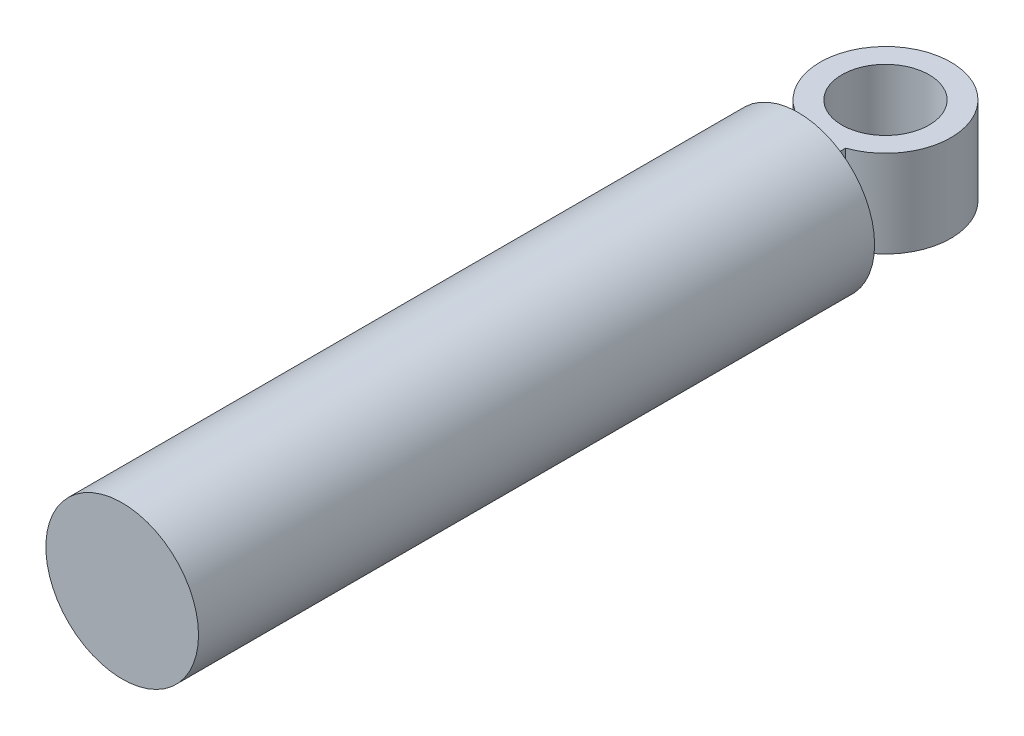
ISO-10303-21;
HEADER;
FILE_DESCRIPTION(('STEP AP214'),'2;1');
FILE_NAME('part.step','',(''),(''),'','','');
FILE_SCHEMA(('AUTOMOTIVE_DESIGN { 1 0 10303 214 1 1 1 1 }'));
ENDSEC;
DATA;
#1=APPLICATION_CONTEXT('core data for automotive mechanical design processes');
#2=APPLICATION_PROTOCOL_DEFINITION('international standard','automotive_design',2000,#1);
#3=PRODUCT_CONTEXT('',#1,'mechanical');
#4=PRODUCT('Part','Part','',(#3));
#5=PRODUCT_RELATED_PRODUCT_CATEGORY('part','',(#4));
#6=PRODUCT_DEFINITION_FORMATION('','',#4);
#7=PRODUCT_DEFINITION_CONTEXT('part definition',#1,'design');
#8=PRODUCT_DEFINITION('design','',#6,#7);
#9=PRODUCT_DEFINITION_SHAPE('','',#8);
#10=(LENGTH_UNIT() NAMED_UNIT(*) SI_UNIT(.MILLI.,.METRE.));
#11=(NAMED_UNIT(*) PLANE_ANGLE_UNIT() SI_UNIT($,.RADIAN.));
#12=(NAMED_UNIT(*) SI_UNIT($,.STERADIAN.) SOLID_ANGLE_UNIT());
#13=UNCERTAINTY_MEASURE_WITH_UNIT(LENGTH_MEASURE(1.E-05),#10,'distance_accuracy_value','');
#14=(GEOMETRIC_REPRESENTATION_CONTEXT(3) GLOBAL_UNCERTAINTY_ASSIGNED_CONTEXT((#13)) GLOBAL_UNIT_ASSIGNED_CONTEXT((#10,
#11,#12)) REPRESENTATION_CONTEXT('',''));
#15=CARTESIAN_POINT('',(0.,0.,0.));
#16=DIRECTION('',(0.,0.,1.));
#17=DIRECTION('',(1.,0.,0.));
#18=AXIS2_PLACEMENT_3D('',#15,#16,#17);
#19=CARTESIAN_POINT('',(0.,0.,0.));
#20=DIRECTION('',(0.,0.,1.));
#21=DIRECTION('',(1.,0.,0.));
#22=AXIS2_PLACEMENT_3D('',#19,#20,#21);
#23=PLANE('',#22);
#24=CARTESIAN_POINT('',(0.,0.,0.));
#25=DIRECTION('',(0.,0.,1.));
#26=DIRECTION('',(1.,0.,0.));
#27=AXIS2_PLACEMENT_3D('',#24,#25,#26);
#28=CIRCLE('',#27,35.);
#29=CARTESIAN_POINT('',(35.,0.,0.));
#30=VERTEX_POINT('',#29);
#31=EDGE_CURVE('E36',#30,#30,#28,.T.);
#32=ORIENTED_EDGE('',*,*,#31,.F.);
#33=EDGE_LOOP('',(#32));
#34=FACE_BOUND('',#33,.T.);
#35=DIRECTION('',(0.,-1.,0.));
#36=VECTOR('',#35,1.);
#37=CARTESIAN_POINT('',(10.,20.,0.));
#38=LINE('',#37,#36);
#39=CARTESIAN_POINT('',(10.,20.,0.));
#40=VERTEX_POINT('',#39);
#41=CARTESIAN_POINT('',(10.,-20.,0.));
#42=VERTEX_POINT('',#41);
#43=EDGE_CURVE('E47',#40,#42,#38,.T.);
#44=ORIENTED_EDGE('',*,*,#43,.F.);
#45=DIRECTION('',(1.,0.,0.));
#46=VECTOR('',#45,1.);
#47=CARTESIAN_POINT('',(-10.,20.,0.));
#48=LINE('',#47,#46);
#49=CARTESIAN_POINT('',(-10.,20.,0.));
#50=VERTEX_POINT('',#49);
#51=EDGE_CURVE('E79',#50,#40,#48,.T.);
#52=ORIENTED_EDGE('',*,*,#51,.F.);
#53=DIRECTION('',(0.,-1.,0.));
#54=VECTOR('',#53,1.);
#55=CARTESIAN_POINT('',(-10.,20.,0.));
#56=LINE('',#55,#54);
#57=CARTESIAN_POINT('',(-10.,-20.,0.));
#58=VERTEX_POINT('',#57);
#59=EDGE_CURVE('E95',#50,#58,#56,.T.);
#60=ORIENTED_EDGE('',*,*,#59,.T.);
#61=DIRECTION('',(1.,0.,0.));
#62=VECTOR('',#61,1.);
#63=CARTESIAN_POINT('',(-10.,-20.,0.));
#64=LINE('',#63,#62);
#65=EDGE_CURVE('E52',#58,#42,#64,.T.);
#66=ORIENTED_EDGE('',*,*,#65,.T.);
#67=EDGE_LOOP('',(#44,#52,#60,#66));
#68=FACE_BOUND('',#67,.T.);
#69=ADVANCED_FACE('F32',(#34,#68),#23,.F.);
#70=CARTESIAN_POINT('',(0.,0.,310.));
#71=DIRECTION('',(0.,0.,-1.));
#72=DIRECTION('',(-1.,0.,0.));
#73=AXIS2_PLACEMENT_3D('',#70,#71,#72);
#74=CYLINDRICAL_SURFACE('',#73,35.);
#75=CARTESIAN_POINT('',(0.,0.,310.));
#76=DIRECTION('',(0.,0.,1.));
#77=DIRECTION('',(1.,0.,0.));
#78=AXIS2_PLACEMENT_3D('',#75,#76,#77);
#79=CIRCLE('',#78,35.);
#80=CARTESIAN_POINT('',(35.,0.,310.));
#81=VERTEX_POINT('',#80);
#82=EDGE_CURVE('E11',#81,#81,#79,.T.);
#83=ORIENTED_EDGE('',*,*,#82,.F.);
#84=EDGE_LOOP('',(#83));
#85=FACE_BOUND('',#84,.T.);
#86=ORIENTED_EDGE('',*,*,#31,.T.);
#87=EDGE_LOOP('',(#86));
#88=FACE_BOUND('',#87,.T.);
#89=ADVANCED_FACE('F34',(#85,#88),#74,.T.);
#90=CARTESIAN_POINT('',(0.,0.,310.));
#91=DIRECTION('',(0.,0.,1.));
#92=DIRECTION('',(1.,0.,0.));
#93=AXIS2_PLACEMENT_3D('',#90,#91,#92);
#94=PLANE('',#93);
#95=ORIENTED_EDGE('',*,*,#82,.T.);
#96=EDGE_LOOP('',(#95));
#97=FACE_BOUND('',#96,.T.);
#98=ADVANCED_FACE('F117',(#97),#94,.T.);
#99=CARTESIAN_POINT('',(0.,20.,-40.));
#100=DIRECTION('',(0.,1.,0.));
#101=DIRECTION('',(0.,0.,1.));
#102=AXIS2_PLACEMENT_3D('',#99,#100,#101);
#103=PLANE('',#102);
#104=ORIENTED_EDGE('',*,*,#51,.T.);
#105=DIRECTION('',(0.,0.,-1.));
#106=VECTOR('',#105,1.);
#107=CARTESIAN_POINT('',(10.,20.,0.));
#108=LINE('',#107,#106);
#109=CARTESIAN_POINT('',(9.99999999999999,20.,-11.7157287525381));
#110=VERTEX_POINT('',#109);
#111=EDGE_CURVE('E71',#40,#110,#108,.T.);
#112=ORIENTED_EDGE('',*,*,#111,.T.);
#113=CARTESIAN_POINT('',(0.,20.,-40.));
#114=DIRECTION('',(0.,1.,0.));
#115=DIRECTION('',(0.,0.,1.));
#116=AXIS2_PLACEMENT_3D('',#113,#114,#115);
#117=CIRCLE('',#116,30.);
#118=CARTESIAN_POINT('',(-10.,20.,-11.7157287525381));
#119=VERTEX_POINT('',#118);
#120=EDGE_CURVE('E77',#110,#119,#117,.T.);
#121=ORIENTED_EDGE('',*,*,#120,.T.);
#122=DIRECTION('',(0.,0.,1.));
#123=VECTOR('',#122,1.);
#124=CARTESIAN_POINT('',(-10.,20.,0.));
#125=LINE('',#124,#123);
#126=EDGE_CURVE('E93',#119,#50,#125,.T.);
#127=ORIENTED_EDGE('',*,*,#126,.T.);
#128=EDGE_LOOP('',(#104,#112,#121,#127));
#129=FACE_BOUND('',#128,.T.);
#130=CARTESIAN_POINT('',(0.,20.,-40.));
#131=DIRECTION('',(0.,1.,0.));
#132=DIRECTION('',(0.,0.,1.));
#133=AXIS2_PLACEMENT_3D('',#130,#131,#132);
#134=CIRCLE('',#133,20.);
#135=CARTESIAN_POINT('',(0.,20.,-20.));
#136=VERTEX_POINT('',#135);
#137=EDGE_CURVE('E100',#136,#136,#134,.T.);
#138=ORIENTED_EDGE('',*,*,#137,.F.);
#139=EDGE_LOOP('',(#138));
#140=FACE_BOUND('',#139,.T.);
#141=ADVANCED_FACE('F73',(#129,#140),#103,.T.);
#142=CARTESIAN_POINT('',(0.,-20.,-40.));
#143=DIRECTION('',(0.,1.,0.));
#144=DIRECTION('',(0.,0.,1.));
#145=AXIS2_PLACEMENT_3D('',#142,#143,#144);
#146=PLANE('',#145);
#147=ORIENTED_EDGE('',*,*,#65,.F.);
#148=DIRECTION('',(0.,0.,1.));
#149=VECTOR('',#148,1.);
#150=CARTESIAN_POINT('',(-10.,-20.,0.));
#151=LINE('',#150,#149);
#152=CARTESIAN_POINT('',(-10.,-20.,-11.7157287525381));
#153=VERTEX_POINT('',#152);
#154=EDGE_CURVE('E104',#153,#58,#151,.T.);
#155=ORIENTED_EDGE('',*,*,#154,.F.);
#156=CARTESIAN_POINT('',(0.,-20.,-40.));
#157=DIRECTION('',(0.,1.,0.));
#158=DIRECTION('',(0.,0.,1.));
#159=AXIS2_PLACEMENT_3D('',#156,#157,#158);
#160=CIRCLE('',#159,30.);
#161=CARTESIAN_POINT('',(9.99999999999999,-20.,-11.7157287525381));
#162=VERTEX_POINT('',#161);
#163=EDGE_CURVE('E102',#162,#153,#160,.T.);
#164=ORIENTED_EDGE('',*,*,#163,.F.);
#165=DIRECTION('',(0.,0.,-1.));
#166=VECTOR('',#165,1.);
#167=CARTESIAN_POINT('',(10.,-20.,0.));
#168=LINE('',#167,#166);
#169=EDGE_CURVE('E85',#42,#162,#168,.T.);
#170=ORIENTED_EDGE('',*,*,#169,.F.);
#171=EDGE_LOOP('',(#147,#155,#164,#170));
#172=FACE_BOUND('',#171,.T.);
#173=CARTESIAN_POINT('',(0.,-20.,-40.));
#174=DIRECTION('',(0.,1.,0.));
#175=DIRECTION('',(0.,0.,1.));
#176=AXIS2_PLACEMENT_3D('',#173,#174,#175);
#177=CIRCLE('',#176,20.);
#178=CARTESIAN_POINT('',(0.,-20.,-20.));
#179=VERTEX_POINT('',#178);
#180=EDGE_CURVE('E147',#179,#179,#177,.T.);
#181=ORIENTED_EDGE('',*,*,#180,.T.);
#182=EDGE_LOOP('',(#181));
#183=FACE_BOUND('',#182,.T.);
#184=ADVANCED_FACE('F125',(#172,#183),#146,.F.);
#185=CARTESIAN_POINT('',(10.,20.,0.));
#186=DIRECTION('',(-1.,0.,0.));
#187=DIRECTION('',(0.,0.,1.));
#188=AXIS2_PLACEMENT_3D('',#185,#186,#187);
#189=PLANE('',#188);
#190=ORIENTED_EDGE('',*,*,#169,.T.);
#191=DIRECTION('',(0.,-1.,0.));
#192=VECTOR('',#191,1.);
#193=CARTESIAN_POINT('',(9.99999999999999,20.,-11.7157287525381));
#194=LINE('',#193,#192);
#195=EDGE_CURVE('E83',#110,#162,#194,.T.);
#196=ORIENTED_EDGE('',*,*,#195,.F.);
#197=ORIENTED_EDGE('',*,*,#111,.F.);
#198=ORIENTED_EDGE('',*,*,#43,.T.);
#199=EDGE_LOOP('',(#190,#196,#197,#198));
#200=FACE_BOUND('',#199,.T.);
#201=ADVANCED_FACE('F84',(#200),#189,.F.);
#202=CARTESIAN_POINT('',(0.,20.,-40.));
#203=DIRECTION('',(0.,-1.,0.));
#204=DIRECTION('',(0.,0.,-1.));
#205=AXIS2_PLACEMENT_3D('',#202,#203,#204);
#206=CYLINDRICAL_SURFACE('',#205,30.);
#207=ORIENTED_EDGE('',*,*,#163,.T.);
#208=DIRECTION('',(0.,-1.,0.));
#209=VECTOR('',#208,1.);
#210=CARTESIAN_POINT('',(-10.,20.,-11.7157287525381));
#211=LINE('',#210,#209);
#212=EDGE_CURVE('E88',#119,#153,#211,.T.);
#213=ORIENTED_EDGE('',*,*,#212,.F.);
#214=ORIENTED_EDGE('',*,*,#120,.F.);
#215=ORIENTED_EDGE('',*,*,#195,.T.);
#216=EDGE_LOOP('',(#207,#213,#214,#215));
#217=FACE_BOUND('',#216,.T.);
#218=ADVANCED_FACE('F90',(#217),#206,.T.);
#219=CARTESIAN_POINT('',(-10.,20.,0.));
#220=DIRECTION('',(1.,0.,0.));
#221=DIRECTION('',(0.,0.,-1.));
#222=AXIS2_PLACEMENT_3D('',#219,#220,#221);
#223=PLANE('',#222);
#224=ORIENTED_EDGE('',*,*,#154,.T.);
#225=ORIENTED_EDGE('',*,*,#59,.F.);
#226=ORIENTED_EDGE('',*,*,#126,.F.);
#227=ORIENTED_EDGE('',*,*,#212,.T.);
#228=EDGE_LOOP('',(#224,#225,#226,#227));
#229=FACE_BOUND('',#228,.T.);
#230=ADVANCED_FACE('F128',(#229),#223,.F.);
#231=CARTESIAN_POINT('',(0.,20.,-40.));
#232=DIRECTION('',(0.,-1.,0.));
#233=DIRECTION('',(0.,0.,-1.));
#234=AXIS2_PLACEMENT_3D('',#231,#232,#233);
#235=CYLINDRICAL_SURFACE('',#234,20.);
#236=ORIENTED_EDGE('',*,*,#137,.T.);
#237=EDGE_LOOP('',(#236));
#238=FACE_BOUND('',#237,.T.);
#239=ORIENTED_EDGE('',*,*,#180,.F.);
#240=EDGE_LOOP('',(#239));
#241=FACE_BOUND('',#240,.T.);
#242=ADVANCED_FACE('F131',(#238,#241),#235,.F.);
#243=CLOSED_SHELL('',(#69,#89,#98,#141,#184,#201,#218,#230,#242));
#244=MANIFOLD_SOLID_BREP('B2',#243);
#245=ADVANCED_BREP_SHAPE_REPRESENTATION('',(#18,#244),#14);
#246=SHAPE_DEFINITION_REPRESENTATION(#9,#245);
ENDSEC;
END-ISO-10303-21;
